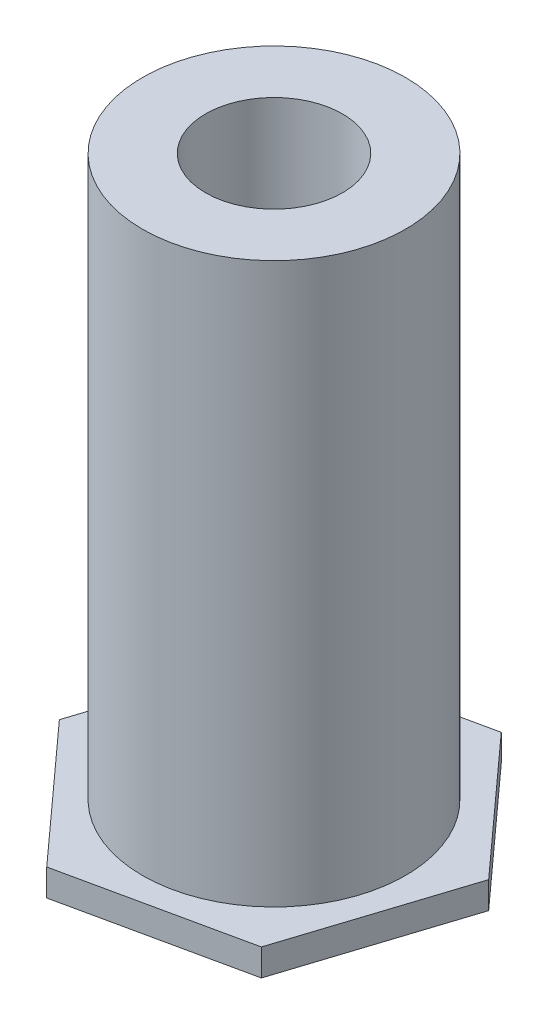
ISO-10303-21;
HEADER;
FILE_DESCRIPTION(('STEP AP214'),'2;1');
FILE_NAME('part.step','',(''),(''),'','','');
FILE_SCHEMA(('AUTOMOTIVE_DESIGN { 1 0 10303 214 1 1 1 1 }'));
ENDSEC;
DATA;
#1=APPLICATION_CONTEXT('core data for automotive mechanical design processes');
#2=APPLICATION_PROTOCOL_DEFINITION('international standard','automotive_design',2000,#1);
#3=PRODUCT_CONTEXT('',#1,'mechanical');
#4=PRODUCT('Part','Part','',(#3));
#5=PRODUCT_RELATED_PRODUCT_CATEGORY('part','',(#4));
#6=PRODUCT_DEFINITION_FORMATION('','',#4);
#7=PRODUCT_DEFINITION_CONTEXT('part definition',#1,'design');
#8=PRODUCT_DEFINITION('design','',#6,#7);
#9=PRODUCT_DEFINITION_SHAPE('','',#8);
#10=(LENGTH_UNIT() NAMED_UNIT(*) SI_UNIT(.MILLI.,.METRE.));
#11=(NAMED_UNIT(*) PLANE_ANGLE_UNIT() SI_UNIT($,.RADIAN.));
#12=(NAMED_UNIT(*) SI_UNIT($,.STERADIAN.) SOLID_ANGLE_UNIT());
#13=UNCERTAINTY_MEASURE_WITH_UNIT(LENGTH_MEASURE(1.E-05),#10,'distance_accuracy_value','');
#14=(GEOMETRIC_REPRESENTATION_CONTEXT(3) GLOBAL_UNCERTAINTY_ASSIGNED_CONTEXT((#13)) GLOBAL_UNIT_ASSIGNED_CONTEXT((#10,
#11,#12)) REPRESENTATION_CONTEXT('',''));
#15=CARTESIAN_POINT('',(0.,0.,0.));
#16=DIRECTION('',(0.,0.,1.));
#17=DIRECTION('',(1.,0.,0.));
#18=AXIS2_PLACEMENT_3D('',#15,#16,#17);
#19=CARTESIAN_POINT('',(-1.13165123966944,0.55,3.51748472705823));
#20=DIRECTION('',(-0.210742854930006,0.,-0.977541533182069));
#21=DIRECTION('',(-0.977541533182069,0.,0.210742854930006));
#22=AXIS2_PLACEMENT_3D('',#19,#20,#21);
#23=PLANE('',#22);
#24=DIRECTION('',(0.977541533182069,0.,-0.210742854930006));
#25=VECTOR('',#24,1.);
#26=CARTESIAN_POINT('',(-1.13165123966944,0.,3.51748472705823));
#27=LINE('',#26,#25);
#28=CARTESIAN_POINT('',(-1.13165123966944,0.,3.51748472705823));
#29=VERTEX_POINT('',#28);
#30=CARTESIAN_POINT('',(2.48040551122148,0.,2.73878108530701));
#31=VERTEX_POINT('',#30);
#32=EDGE_CURVE('E130',#29,#31,#27,.T.);
#33=ORIENTED_EDGE('',*,*,#32,.T.);
#34=DIRECTION('',(0.,-1.,0.));
#35=VECTOR('',#34,1.);
#36=CARTESIAN_POINT('',(2.48040551122148,0.55,2.73878108530701));
#37=LINE('',#36,#35);
#38=CARTESIAN_POINT('',(2.48040551122148,0.55,2.73878108530701));
#39=VERTEX_POINT('',#38);
#40=EDGE_CURVE('E53',#39,#31,#37,.T.);
#41=ORIENTED_EDGE('',*,*,#40,.F.);
#42=DIRECTION('',(0.977541533182069,0.,-0.210742854930006));
#43=VECTOR('',#42,1.);
#44=CARTESIAN_POINT('',(-1.13165123966944,0.55,3.51748472705823));
#45=LINE('',#44,#43);
#46=CARTESIAN_POINT('',(-1.13165123966944,0.55,3.51748472705823));
#47=VERTEX_POINT('',#46);
#48=EDGE_CURVE('E141',#47,#39,#45,.T.);
#49=ORIENTED_EDGE('',*,*,#48,.F.);
#50=DIRECTION('',(0.,-1.,0.));
#51=VECTOR('',#50,1.);
#52=CARTESIAN_POINT('',(-1.13165123966944,0.55,3.51748472705823));
#53=LINE('',#52,#51);
#54=EDGE_CURVE('E126',#47,#29,#53,.T.);
#55=ORIENTED_EDGE('',*,*,#54,.T.);
#56=EDGE_LOOP('',(#33,#41,#49,#55));
#57=FACE_BOUND('',#56,.T.);
#58=ADVANCED_FACE('F45',(#57),#23,.F.);
#59=CARTESIAN_POINT('',(2.48040551122148,0.55,2.73878108530701));
#60=DIRECTION('',(-0.951947228455064,0.,-0.306262100555591));
#61=DIRECTION('',(-0.306262100555591,0.,0.951947228455064));
#62=AXIS2_PLACEMENT_3D('',#59,#60,#61);
#63=PLANE('',#62);
#64=DIRECTION('',(0.306262100555591,0.,-0.951947228455064));
#65=VECTOR('',#64,1.);
#66=CARTESIAN_POINT('',(2.48040551122148,0.,2.73878108530701));
#67=LINE('',#66,#65);
#68=CARTESIAN_POINT('',(3.61205675089093,0.,-0.778703641751226));
#69=VERTEX_POINT('',#68);
#70=EDGE_CURVE('E133',#31,#69,#67,.T.);
#71=ORIENTED_EDGE('',*,*,#70,.T.);
#72=DIRECTION('',(0.,-1.,0.));
#73=VECTOR('',#72,1.);
#74=CARTESIAN_POINT('',(3.61205675089093,0.55,-0.778703641751226));
#75=LINE('',#74,#73);
#76=CARTESIAN_POINT('',(3.61205675089093,0.55,-0.778703641751226));
#77=VERTEX_POINT('',#76);
#78=EDGE_CURVE('E145',#77,#69,#75,.T.);
#79=ORIENTED_EDGE('',*,*,#78,.F.);
#80=DIRECTION('',(0.306262100555591,0.,-0.951947228455064));
#81=VECTOR('',#80,1.);
#82=CARTESIAN_POINT('',(2.48040551122148,0.55,2.73878108530701));
#83=LINE('',#82,#81);
#84=EDGE_CURVE('E99',#39,#77,#83,.T.);
#85=ORIENTED_EDGE('',*,*,#84,.F.);
#86=ORIENTED_EDGE('',*,*,#40,.T.);
#87=EDGE_LOOP('',(#71,#79,#85,#86));
#88=FACE_BOUND('',#87,.T.);
#89=ADVANCED_FACE('F148',(#88),#63,.F.);
#90=CARTESIAN_POINT('',(3.61205675089093,0.55,-0.778703641751226));
#91=DIRECTION('',(-0.741204373525058,0.,0.671279432626478));
#92=DIRECTION('',(0.671279432626478,0.,0.741204373525058));
#93=AXIS2_PLACEMENT_3D('',#90,#91,#92);
#94=PLANE('',#93);
#95=DIRECTION('',(-0.671279432626478,0.,-0.741204373525058));
#96=VECTOR('',#95,1.);
#97=CARTESIAN_POINT('',(3.61205675089093,0.,-0.778703641751226));
#98=LINE('',#97,#96);
#99=CARTESIAN_POINT('',(1.13165123966944,0.,-3.51748472705823));
#100=VERTEX_POINT('',#99);
#101=EDGE_CURVE('E136',#69,#100,#98,.T.);
#102=ORIENTED_EDGE('',*,*,#101,.T.);
#103=DIRECTION('',(0.,-1.,0.));
#104=VECTOR('',#103,1.);
#105=CARTESIAN_POINT('',(1.13165123966944,0.55,-3.51748472705823));
#106=LINE('',#105,#104);
#107=CARTESIAN_POINT('',(1.13165123966944,0.55,-3.51748472705823));
#108=VERTEX_POINT('',#107);
#109=EDGE_CURVE('E121',#108,#100,#106,.T.);
#110=ORIENTED_EDGE('',*,*,#109,.F.);
#111=DIRECTION('',(-0.671279432626478,0.,-0.741204373525058));
#112=VECTOR('',#111,1.);
#113=CARTESIAN_POINT('',(3.61205675089093,0.55,-0.778703641751226));
#114=LINE('',#113,#112);
#115=EDGE_CURVE('E112',#77,#108,#114,.T.);
#116=ORIENTED_EDGE('',*,*,#115,.F.);
#117=ORIENTED_EDGE('',*,*,#78,.T.);
#118=EDGE_LOOP('',(#102,#110,#116,#117));
#119=FACE_BOUND('',#118,.T.);
#120=ADVANCED_FACE('F156',(#119),#94,.F.);
#121=CARTESIAN_POINT('',(1.13165123966944,0.55,-3.51748472705823));
#122=DIRECTION('',(0.210742854930006,0.,0.977541533182069));
#123=DIRECTION('',(0.977541533182069,0.,-0.210742854930006));
#124=AXIS2_PLACEMENT_3D('',#121,#122,#123);
#125=PLANE('',#124);
#126=DIRECTION('',(-0.977541533182069,0.,0.210742854930006));
#127=VECTOR('',#126,1.);
#128=CARTESIAN_POINT('',(1.13165123966944,0.,-3.51748472705823));
#129=LINE('',#128,#127);
#130=CARTESIAN_POINT('',(-2.48040551122148,0.,-2.73878108530701));
#131=VERTEX_POINT('',#130);
#132=EDGE_CURVE('E120',#100,#131,#129,.T.);
#133=ORIENTED_EDGE('',*,*,#132,.T.);
#134=DIRECTION('',(0.,-1.,0.));
#135=VECTOR('',#134,1.);
#136=CARTESIAN_POINT('',(-2.48040551122148,0.55,-2.73878108530701));
#137=LINE('',#136,#135);
#138=CARTESIAN_POINT('',(-2.48040551122148,0.55,-2.73878108530701));
#139=VERTEX_POINT('',#138);
#140=EDGE_CURVE('E117',#139,#131,#137,.T.);
#141=ORIENTED_EDGE('',*,*,#140,.F.);
#142=DIRECTION('',(-0.977541533182069,0.,0.210742854930006));
#143=VECTOR('',#142,1.);
#144=CARTESIAN_POINT('',(1.13165123966944,0.55,-3.51748472705823));
#145=LINE('',#144,#143);
#146=EDGE_CURVE('E106',#108,#139,#145,.T.);
#147=ORIENTED_EDGE('',*,*,#146,.F.);
#148=ORIENTED_EDGE('',*,*,#109,.T.);
#149=EDGE_LOOP('',(#133,#141,#147,#148));
#150=FACE_BOUND('',#149,.T.);
#151=ADVANCED_FACE('F118',(#150),#125,.F.);
#152=CARTESIAN_POINT('',(-2.48040551122148,0.55,-2.73878108530701));
#153=DIRECTION('',(0.951947228455064,0.,0.306262100555591));
#154=DIRECTION('',(0.306262100555591,0.,-0.951947228455064));
#155=AXIS2_PLACEMENT_3D('',#152,#153,#154);
#156=PLANE('',#155);
#157=DIRECTION('',(-0.306262100555591,0.,0.951947228455064));
#158=VECTOR('',#157,1.);
#159=CARTESIAN_POINT('',(-2.48040551122148,0.,-2.73878108530701));
#160=LINE('',#159,#158);
#161=CARTESIAN_POINT('',(-3.61205675089092,0.,0.778703641751226));
#162=VERTEX_POINT('',#161);
#163=EDGE_CURVE('E84',#131,#162,#160,.T.);
#164=ORIENTED_EDGE('',*,*,#163,.T.);
#165=DIRECTION('',(0.,-1.,0.));
#166=VECTOR('',#165,1.);
#167=CARTESIAN_POINT('',(-3.61205675089092,0.55,0.778703641751226));
#168=LINE('',#167,#166);
#169=CARTESIAN_POINT('',(-3.61205675089092,0.55,0.778703641751226));
#170=VERTEX_POINT('',#169);
#171=EDGE_CURVE('E122',#170,#162,#168,.T.);
#172=ORIENTED_EDGE('',*,*,#171,.F.);
#173=DIRECTION('',(-0.306262100555591,0.,0.951947228455064));
#174=VECTOR('',#173,1.);
#175=CARTESIAN_POINT('',(-2.48040551122148,0.55,-2.73878108530701));
#176=LINE('',#175,#174);
#177=EDGE_CURVE('E110',#139,#170,#176,.T.);
#178=ORIENTED_EDGE('',*,*,#177,.F.);
#179=ORIENTED_EDGE('',*,*,#140,.T.);
#180=EDGE_LOOP('',(#164,#172,#178,#179));
#181=FACE_BOUND('',#180,.T.);
#182=ADVANCED_FACE('F124',(#181),#156,.F.);
#183=CARTESIAN_POINT('',(-3.61205675089092,0.55,0.778703641751226));
#184=DIRECTION('',(0.741204373525058,0.,-0.671279432626478));
#185=DIRECTION('',(-0.671279432626478,0.,-0.741204373525058));
#186=AXIS2_PLACEMENT_3D('',#183,#184,#185);
#187=PLANE('',#186);
#188=DIRECTION('',(0.671279432626478,0.,0.741204373525058));
#189=VECTOR('',#188,1.);
#190=CARTESIAN_POINT('',(-3.61205675089092,0.,0.778703641751226));
#191=LINE('',#190,#189);
#192=EDGE_CURVE('E90',#162,#29,#191,.T.);
#193=ORIENTED_EDGE('',*,*,#192,.T.);
#194=ORIENTED_EDGE('',*,*,#54,.F.);
#195=DIRECTION('',(0.671279432626478,0.,0.741204373525058));
#196=VECTOR('',#195,1.);
#197=CARTESIAN_POINT('',(-3.61205675089092,0.55,0.778703641751226));
#198=LINE('',#197,#196);
#199=EDGE_CURVE('E61',#170,#47,#198,.T.);
#200=ORIENTED_EDGE('',*,*,#199,.F.);
#201=ORIENTED_EDGE('',*,*,#171,.T.);
#202=EDGE_LOOP('',(#193,#194,#200,#201));
#203=FACE_BOUND('',#202,.T.);
#204=ADVANCED_FACE('F198',(#203),#187,.F.);
#205=CARTESIAN_POINT('',(0.,0.55,0.));
#206=DIRECTION('',(0.,1.,0.));
#207=DIRECTION('',(0.,0.,1.));
#208=AXIS2_PLACEMENT_3D('',#205,#206,#207);
#209=PLANE('',#208);
#210=CARTESIAN_POINT('',(0.,0.55,0.));
#211=DIRECTION('',(0.,1.,0.));
#212=DIRECTION('',(0.,0.,1.));
#213=AXIS2_PLACEMENT_3D('',#210,#211,#212);
#214=CIRCLE('',#213,2.69);
#215=CARTESIAN_POINT('',(0.,0.55,2.69));
#216=VERTEX_POINT('',#215);
#217=EDGE_CURVE('E160',#216,#216,#214,.T.);
#218=ORIENTED_EDGE('',*,*,#217,.F.);
#219=EDGE_LOOP('',(#218));
#220=FACE_BOUND('',#219,.T.);
#221=ORIENTED_EDGE('',*,*,#48,.T.);
#222=ORIENTED_EDGE('',*,*,#84,.T.);
#223=ORIENTED_EDGE('',*,*,#115,.T.);
#224=ORIENTED_EDGE('',*,*,#146,.T.);
#225=ORIENTED_EDGE('',*,*,#177,.T.);
#226=ORIENTED_EDGE('',*,*,#199,.T.);
#227=EDGE_LOOP('',(#221,#222,#223,#224,#225,#226));
#228=FACE_BOUND('',#227,.T.);
#229=ADVANCED_FACE('F108',(#220,#228),#209,.T.);
#230=CARTESIAN_POINT('',(0.,0.,0.));
#231=DIRECTION('',(0.,1.,0.));
#232=DIRECTION('',(0.,0.,1.));
#233=AXIS2_PLACEMENT_3D('',#230,#231,#232);
#234=PLANE('',#233);
#235=ORIENTED_EDGE('',*,*,#32,.F.);
#236=ORIENTED_EDGE('',*,*,#192,.F.);
#237=ORIENTED_EDGE('',*,*,#163,.F.);
#238=ORIENTED_EDGE('',*,*,#132,.F.);
#239=ORIENTED_EDGE('',*,*,#101,.F.);
#240=ORIENTED_EDGE('',*,*,#70,.F.);
#241=EDGE_LOOP('',(#235,#236,#237,#238,#239,#240));
#242=FACE_BOUND('',#241,.T.);
#243=ADVANCED_FACE('F153',(#242),#234,.F.);
#244=CARTESIAN_POINT('',(0.,12.,0.));
#245=DIRECTION('',(0.,1.,0.));
#246=DIRECTION('',(0.,0.,1.));
#247=AXIS2_PLACEMENT_3D('',#244,#245,#246);
#248=PLANE('',#247);
#249=CARTESIAN_POINT('',(0.,12.,0.));
#250=DIRECTION('',(0.,1.,0.));
#251=DIRECTION('',(0.,0.,1.));
#252=AXIS2_PLACEMENT_3D('',#249,#250,#251);
#253=CIRCLE('',#252,2.69);
#254=CARTESIAN_POINT('',(0.,12.,2.69));
#255=VERTEX_POINT('',#254);
#256=EDGE_CURVE('E134',#255,#255,#253,.T.);
#257=ORIENTED_EDGE('',*,*,#256,.T.);
#258=EDGE_LOOP('',(#257));
#259=FACE_BOUND('',#258,.T.);
#260=CARTESIAN_POINT('',(0.,12.,0.));
#261=DIRECTION('',(0.,1.,0.));
#262=DIRECTION('',(0.,0.,1.));
#263=AXIS2_PLACEMENT_3D('',#260,#261,#262);
#264=CIRCLE('',#263,1.4);
#265=CARTESIAN_POINT('',(0.,12.,1.4));
#266=VERTEX_POINT('',#265);
#267=EDGE_CURVE('E163',#266,#266,#264,.T.);
#268=ORIENTED_EDGE('',*,*,#267,.F.);
#269=EDGE_LOOP('',(#268));
#270=FACE_BOUND('',#269,.T.);
#271=ADVANCED_FACE('F172',(#259,#270),#248,.T.);
#272=CARTESIAN_POINT('',(0.,12.,0.));
#273=DIRECTION('',(0.,-1.,0.));
#274=DIRECTION('',(0.,0.,-1.));
#275=AXIS2_PLACEMENT_3D('',#272,#273,#274);
#276=CYLINDRICAL_SURFACE('',#275,2.69);
#277=ORIENTED_EDGE('',*,*,#256,.F.);
#278=EDGE_LOOP('',(#277));
#279=FACE_BOUND('',#278,.T.);
#280=ORIENTED_EDGE('',*,*,#217,.T.);
#281=EDGE_LOOP('',(#280));
#282=FACE_BOUND('',#281,.T.);
#283=ADVANCED_FACE('F174',(#279,#282),#276,.T.);
#284=CARTESIAN_POINT('',(0.,12.,0.));
#285=DIRECTION('',(0.,-1.,0.));
#286=DIRECTION('',(0.,0.,-1.));
#287=AXIS2_PLACEMENT_3D('',#284,#285,#286);
#288=CYLINDRICAL_SURFACE('',#287,1.4);
#289=ORIENTED_EDGE('',*,*,#267,.T.);
#290=EDGE_LOOP('',(#289));
#291=FACE_BOUND('',#290,.T.);
#292=CARTESIAN_POINT('',(0.,0.55,0.));
#293=DIRECTION('',(0.,1.,0.));
#294=DIRECTION('',(0.,0.,1.));
#295=AXIS2_PLACEMENT_3D('',#292,#293,#294);
#296=CIRCLE('',#295,1.4);
#297=CARTESIAN_POINT('',(0.,0.55,1.4));
#298=VERTEX_POINT('',#297);
#299=EDGE_CURVE('E13',#298,#298,#296,.F.);
#300=ORIENTED_EDGE('',*,*,#299,.T.);
#301=EDGE_LOOP('',(#300));
#302=FACE_BOUND('',#301,.T.);
#303=ADVANCED_FACE('F169',(#291,#302),#288,.F.);
#304=ORIENTED_EDGE('',*,*,#299,.F.);
#305=EDGE_LOOP('',(#304));
#306=FACE_BOUND('',#305,.T.);
#307=ADVANCED_FACE('F203',(#306),#209,.T.);
#308=CLOSED_SHELL('',(#58,#89,#120,#151,#182,#204,#229,#243,#271,#283,#303,#307));
#309=MANIFOLD_SOLID_BREP('B2',#308);
#310=ADVANCED_BREP_SHAPE_REPRESENTATION('',(#18,#309),#14);
#311=SHAPE_DEFINITION_REPRESENTATION(#9,#310);
ENDSEC;
END-ISO-10303-21;
